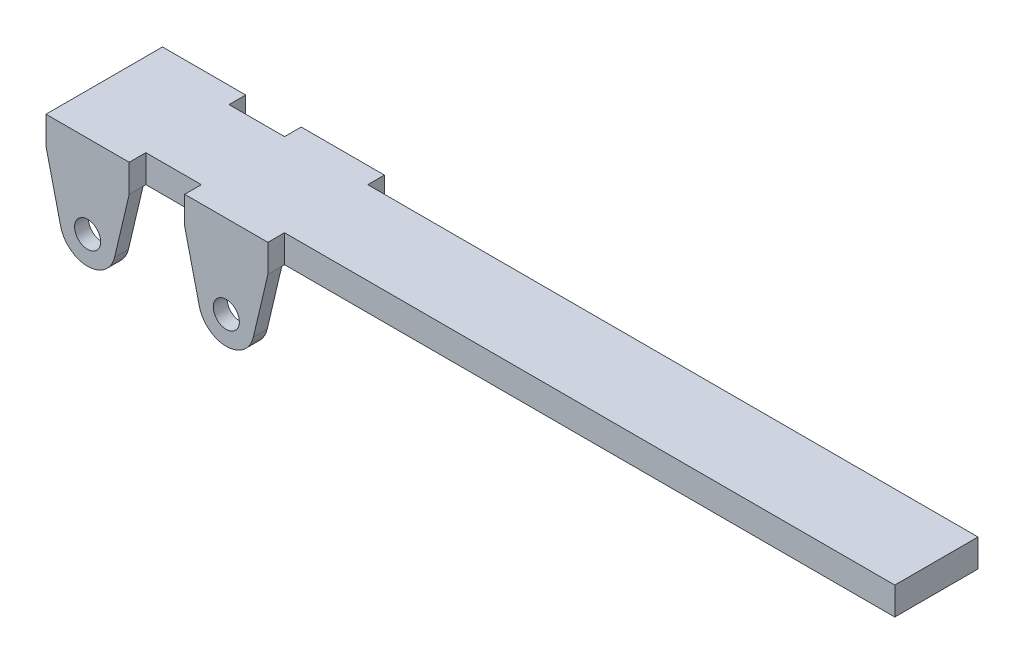
ISO-10303-21;
HEADER;
FILE_DESCRIPTION(('STEP AP214'),'2;1');
FILE_NAME('part.step','',(''),(''),'','','');
FILE_SCHEMA(('AUTOMOTIVE_DESIGN { 1 0 10303 214 1 1 1 1 }'));
ENDSEC;
DATA;
#1=APPLICATION_CONTEXT('core data for automotive mechanical design processes');
#2=APPLICATION_PROTOCOL_DEFINITION('international standard','automotive_design',2000,#1);
#3=PRODUCT_CONTEXT('',#1,'mechanical');
#4=PRODUCT('Part','Part','',(#3));
#5=PRODUCT_RELATED_PRODUCT_CATEGORY('part','',(#4));
#6=PRODUCT_DEFINITION_FORMATION('','',#4);
#7=PRODUCT_DEFINITION_CONTEXT('part definition',#1,'design');
#8=PRODUCT_DEFINITION('design','',#6,#7);
#9=PRODUCT_DEFINITION_SHAPE('','',#8);
#10=(LENGTH_UNIT() NAMED_UNIT(*) SI_UNIT(.MILLI.,.METRE.));
#11=(NAMED_UNIT(*) PLANE_ANGLE_UNIT() SI_UNIT($,.RADIAN.));
#12=(NAMED_UNIT(*) SI_UNIT($,.STERADIAN.) SOLID_ANGLE_UNIT());
#13=UNCERTAINTY_MEASURE_WITH_UNIT(LENGTH_MEASURE(1.E-05),#10,'distance_accuracy_value','');
#14=(GEOMETRIC_REPRESENTATION_CONTEXT(3) GLOBAL_UNCERTAINTY_ASSIGNED_CONTEXT((#13)) GLOBAL_UNIT_ASSIGNED_CONTEXT((#10,
#11,#12)) REPRESENTATION_CONTEXT('',''));
#15=CARTESIAN_POINT('',(0.,0.,0.));
#16=DIRECTION('',(0.,0.,1.));
#17=DIRECTION('',(1.,0.,0.));
#18=AXIS2_PLACEMENT_3D('',#15,#16,#17);
#19=CARTESIAN_POINT('',(0.,0.,0.));
#20=DIRECTION('',(0.,0.,-1.));
#21=DIRECTION('',(-1.,0.,0.));
#22=AXIS2_PLACEMENT_3D('',#19,#20,#21);
#23=PLANE('',#22);
#24=DIRECTION('',(1.,0.,0.));
#25=VECTOR('',#24,1.);
#26=CARTESIAN_POINT('',(150.,0.,0.));
#27=LINE('',#26,#25);
#28=CARTESIAN_POINT('',(40.,0.,0.));
#29=VERTEX_POINT('',#28);
#30=CARTESIAN_POINT('',(150.,0.,0.));
#31=VERTEX_POINT('',#30);
#32=EDGE_CURVE('E265',#29,#31,#27,.T.);
#33=ORIENTED_EDGE('',*,*,#32,.F.);
#34=DIRECTION('',(0.,-1.,0.));
#35=VECTOR('',#34,1.);
#36=CARTESIAN_POINT('',(40.,0.,0.));
#37=LINE('',#36,#35);
#38=CARTESIAN_POINT('',(40.,5.,0.));
#39=VERTEX_POINT('',#38);
#40=EDGE_CURVE('E256',#39,#29,#37,.T.);
#41=ORIENTED_EDGE('',*,*,#40,.F.);
#42=DIRECTION('',(-1.,0.,0.));
#43=VECTOR('',#42,1.);
#44=CARTESIAN_POINT('',(0.,5.,0.));
#45=LINE('',#44,#43);
#46=CARTESIAN_POINT('',(150.,5.,0.));
#47=VERTEX_POINT('',#46);
#48=EDGE_CURVE('E277',#47,#39,#45,.T.);
#49=ORIENTED_EDGE('',*,*,#48,.F.);
#50=DIRECTION('',(0.,1.,0.));
#51=VECTOR('',#50,1.);
#52=CARTESIAN_POINT('',(150.,5.,0.));
#53=LINE('',#52,#51);
#54=EDGE_CURVE('E282',#31,#47,#53,.T.);
#55=ORIENTED_EDGE('',*,*,#54,.F.);
#56=EDGE_LOOP('',(#33,#41,#49,#55));
#57=FACE_BOUND('',#56,.T.);
#58=ADVANCED_FACE('F41',(#57),#23,.T.);
#59=CARTESIAN_POINT('',(25.,5.,0.));
#60=VERTEX_POINT('',#59);
#61=CARTESIAN_POINT('',(15.,5.,0.));
#62=VERTEX_POINT('',#61);
#63=EDGE_CURVE('E284',#60,#62,#45,.T.);
#64=ORIENTED_EDGE('',*,*,#63,.F.);
#65=DIRECTION('',(0.,1.,0.));
#66=VECTOR('',#65,1.);
#67=CARTESIAN_POINT('',(25.,0.,0.));
#68=LINE('',#67,#66);
#69=CARTESIAN_POINT('',(25.,0.,0.));
#70=VERTEX_POINT('',#69);
#71=EDGE_CURVE('E344',#70,#60,#68,.T.);
#72=ORIENTED_EDGE('',*,*,#71,.F.);
#73=CARTESIAN_POINT('',(15.,0.,0.));
#74=VERTEX_POINT('',#73);
#75=EDGE_CURVE('E268',#74,#70,#27,.T.);
#76=ORIENTED_EDGE('',*,*,#75,.F.);
#77=DIRECTION('',(0.,1.,0.));
#78=VECTOR('',#77,1.);
#79=CARTESIAN_POINT('',(15.,0.,0.));
#80=LINE('',#79,#78);
#81=EDGE_CURVE('E421',#74,#62,#80,.T.);
#82=ORIENTED_EDGE('',*,*,#81,.T.);
#83=EDGE_LOOP('',(#64,#72,#76,#82));
#84=FACE_BOUND('',#83,.T.);
#85=ADVANCED_FACE('F509',(#84),#23,.T.);
#86=CARTESIAN_POINT('',(0.,0.,15.));
#87=DIRECTION('',(0.,0.,-1.));
#88=DIRECTION('',(-1.,0.,0.));
#89=AXIS2_PLACEMENT_3D('',#86,#87,#88);
#90=PLANE('',#89);
#91=DIRECTION('',(-1.,0.,0.));
#92=VECTOR('',#91,1.);
#93=CARTESIAN_POINT('',(0.,5.,15.));
#94=LINE('',#93,#92);
#95=CARTESIAN_POINT('',(150.,5.,15.));
#96=VERTEX_POINT('',#95);
#97=CARTESIAN_POINT('',(40.,5.,15.));
#98=VERTEX_POINT('',#97);
#99=EDGE_CURVE('E242',#96,#98,#94,.T.);
#100=ORIENTED_EDGE('',*,*,#99,.T.);
#101=DIRECTION('',(0.,-1.,0.));
#102=VECTOR('',#101,1.);
#103=CARTESIAN_POINT('',(40.,0.,15.));
#104=LINE('',#103,#102);
#105=CARTESIAN_POINT('',(40.,0.,15.));
#106=VERTEX_POINT('',#105);
#107=EDGE_CURVE('E376',#98,#106,#104,.T.);
#108=ORIENTED_EDGE('',*,*,#107,.T.);
#109=DIRECTION('',(1.,0.,0.));
#110=VECTOR('',#109,1.);
#111=CARTESIAN_POINT('',(150.,0.,15.));
#112=LINE('',#111,#110);
#113=CARTESIAN_POINT('',(150.,0.,15.));
#114=VERTEX_POINT('',#113);
#115=EDGE_CURVE('E274',#106,#114,#112,.T.);
#116=ORIENTED_EDGE('',*,*,#115,.T.);
#117=DIRECTION('',(0.,1.,0.));
#118=VECTOR('',#117,1.);
#119=CARTESIAN_POINT('',(150.,5.,15.));
#120=LINE('',#119,#118);
#121=EDGE_CURVE('E278',#114,#96,#120,.T.);
#122=ORIENTED_EDGE('',*,*,#121,.T.);
#123=EDGE_LOOP('',(#100,#108,#116,#122));
#124=FACE_BOUND('',#123,.T.);
#125=ADVANCED_FACE('F554',(#124),#90,.F.);
#126=CARTESIAN_POINT('',(15.,0.,15.));
#127=VERTEX_POINT('',#126);
#128=CARTESIAN_POINT('',(25.,0.,15.));
#129=VERTEX_POINT('',#128);
#130=EDGE_CURVE('E276',#127,#129,#112,.T.);
#131=ORIENTED_EDGE('',*,*,#130,.T.);
#132=DIRECTION('',(0.,1.,0.));
#133=VECTOR('',#132,1.);
#134=CARTESIAN_POINT('',(25.,0.,15.));
#135=LINE('',#134,#133);
#136=CARTESIAN_POINT('',(25.,5.,15.));
#137=VERTEX_POINT('',#136);
#138=EDGE_CURVE('E381',#129,#137,#135,.T.);
#139=ORIENTED_EDGE('',*,*,#138,.T.);
#140=CARTESIAN_POINT('',(15.,5.,15.));
#141=VERTEX_POINT('',#140);
#142=EDGE_CURVE('E280',#137,#141,#94,.T.);
#143=ORIENTED_EDGE('',*,*,#142,.T.);
#144=DIRECTION('',(0.,1.,0.));
#145=VECTOR('',#144,1.);
#146=CARTESIAN_POINT('',(15.,0.,15.));
#147=LINE('',#146,#145);
#148=EDGE_CURVE('E457',#127,#141,#147,.T.);
#149=ORIENTED_EDGE('',*,*,#148,.F.);
#150=EDGE_LOOP('',(#131,#139,#143,#149));
#151=FACE_BOUND('',#150,.T.);
#152=ADVANCED_FACE('F558',(#151),#90,.F.);
#153=CARTESIAN_POINT('',(150.,0.,15.));
#154=DIRECTION('',(0.,1.,0.));
#155=DIRECTION('',(-1.,0.,0.));
#156=AXIS2_PLACEMENT_3D('',#153,#154,#155);
#157=PLANE('',#156);
#158=DIRECTION('',(0.,0.,-1.));
#159=VECTOR('',#158,1.);
#160=CARTESIAN_POINT('',(150.,0.,15.));
#161=LINE('',#160,#159);
#162=EDGE_CURVE('E11',#114,#31,#161,.T.);
#163=ORIENTED_EDGE('',*,*,#162,.F.);
#164=ORIENTED_EDGE('',*,*,#115,.F.);
#165=DIRECTION('',(0.,0.,1.));
#166=VECTOR('',#165,1.);
#167=CARTESIAN_POINT('',(40.,0.,18.));
#168=LINE('',#167,#166);
#169=CARTESIAN_POINT('',(40.,0.,15.5));
#170=VERTEX_POINT('',#169);
#171=EDGE_CURVE('E321',#106,#170,#168,.T.);
#172=ORIENTED_EDGE('',*,*,#171,.T.);
#173=DIRECTION('',(-1.,0.,0.));
#174=VECTOR('',#173,1.);
#175=CARTESIAN_POINT('',(53.,0.,15.5));
#176=LINE('',#175,#174);
#177=CARTESIAN_POINT('',(25.,0.,15.5));
#178=VERTEX_POINT('',#177);
#179=EDGE_CURVE('E58',#170,#178,#176,.T.);
#180=ORIENTED_EDGE('',*,*,#179,.T.);
#181=DIRECTION('',(0.,0.,-1.));
#182=VECTOR('',#181,1.);
#183=CARTESIAN_POINT('',(25.,0.,18.));
#184=LINE('',#183,#182);
#185=EDGE_CURVE('E324',#178,#129,#184,.T.);
#186=ORIENTED_EDGE('',*,*,#185,.T.);
#187=ORIENTED_EDGE('',*,*,#130,.F.);
#188=DIRECTION('',(0.,0.,-1.));
#189=VECTOR('',#188,1.);
#190=CARTESIAN_POINT('',(15.,0.,18.));
#191=LINE('',#190,#189);
#192=CARTESIAN_POINT('',(15.,0.,15.5));
#193=VERTEX_POINT('',#192);
#194=EDGE_CURVE('E260',#193,#127,#191,.T.);
#195=ORIENTED_EDGE('',*,*,#194,.F.);
#196=CARTESIAN_POINT('',(0.,0.,15.5));
#197=VERTEX_POINT('',#196);
#198=EDGE_CURVE('E249',#193,#197,#176,.T.);
#199=ORIENTED_EDGE('',*,*,#198,.T.);
#200=DIRECTION('',(0.,0.,-1.));
#201=VECTOR('',#200,1.);
#202=CARTESIAN_POINT('',(0.,0.,15.));
#203=LINE('',#202,#201);
#204=CARTESIAN_POINT('',(0.,0.,-0.5));
#205=VERTEX_POINT('',#204);
#206=EDGE_CURVE('E229',#197,#205,#203,.T.);
#207=ORIENTED_EDGE('',*,*,#206,.T.);
#208=DIRECTION('',(-1.,0.,0.));
#209=VECTOR('',#208,1.);
#210=CARTESIAN_POINT('',(53.,0.,-0.5));
#211=LINE('',#210,#209);
#212=CARTESIAN_POINT('',(15.,0.,-0.5));
#213=VERTEX_POINT('',#212);
#214=EDGE_CURVE('E299',#213,#205,#211,.T.);
#215=ORIENTED_EDGE('',*,*,#214,.F.);
#216=DIRECTION('',(0.,0.,1.));
#217=VECTOR('',#216,1.);
#218=CARTESIAN_POINT('',(15.,0.,-3.));
#219=LINE('',#218,#217);
#220=EDGE_CURVE('E326',#213,#74,#219,.T.);
#221=ORIENTED_EDGE('',*,*,#220,.T.);
#222=ORIENTED_EDGE('',*,*,#75,.T.);
#223=DIRECTION('',(0.,0.,1.));
#224=VECTOR('',#223,1.);
#225=CARTESIAN_POINT('',(25.,0.,-3.));
#226=LINE('',#225,#224);
#227=CARTESIAN_POINT('',(25.,0.,-0.5));
#228=VERTEX_POINT('',#227);
#229=EDGE_CURVE('E363',#228,#70,#226,.T.);
#230=ORIENTED_EDGE('',*,*,#229,.F.);
#231=CARTESIAN_POINT('',(40.,0.,-0.5));
#232=VERTEX_POINT('',#231);
#233=EDGE_CURVE('E292',#232,#228,#211,.T.);
#234=ORIENTED_EDGE('',*,*,#233,.F.);
#235=DIRECTION('',(0.,0.,-1.));
#236=VECTOR('',#235,1.);
#237=CARTESIAN_POINT('',(40.,0.,-3.));
#238=LINE('',#237,#236);
#239=EDGE_CURVE('E318',#29,#232,#238,.T.);
#240=ORIENTED_EDGE('',*,*,#239,.F.);
#241=ORIENTED_EDGE('',*,*,#32,.T.);
#242=EDGE_LOOP('',(#163,#164,#172,#180,#186,#187,#195,#199,#207,#215,#221,#222,#230,#234,#240,#241));
#243=FACE_BOUND('',#242,.T.);
#244=ADVANCED_FACE('F43',(#243),#157,.F.);
#245=CARTESIAN_POINT('',(150.,5.,15.));
#246=DIRECTION('',(-1.,0.,0.));
#247=DIRECTION('',(0.,-1.,0.));
#248=AXIS2_PLACEMENT_3D('',#245,#246,#247);
#249=PLANE('',#248);
#250=ORIENTED_EDGE('',*,*,#54,.T.);
#251=DIRECTION('',(0.,0.,-1.));
#252=VECTOR('',#251,1.);
#253=CARTESIAN_POINT('',(150.,5.,15.));
#254=LINE('',#253,#252);
#255=EDGE_CURVE('E50',#96,#47,#254,.T.);
#256=ORIENTED_EDGE('',*,*,#255,.F.);
#257=ORIENTED_EDGE('',*,*,#121,.F.);
#258=ORIENTED_EDGE('',*,*,#162,.T.);
#259=EDGE_LOOP('',(#250,#256,#257,#258));
#260=FACE_BOUND('',#259,.T.);
#261=ADVANCED_FACE('F562',(#260),#249,.F.);
#262=CARTESIAN_POINT('',(0.,5.,15.));
#263=DIRECTION('',(0.,-1.,0.));
#264=DIRECTION('',(0.,0.,-1.));
#265=AXIS2_PLACEMENT_3D('',#262,#263,#264);
#266=PLANE('',#265);
#267=ORIENTED_EDGE('',*,*,#48,.T.);
#268=DIRECTION('',(0.,0.,1.));
#269=VECTOR('',#268,1.);
#270=CARTESIAN_POINT('',(40.,5.,-3.));
#271=LINE('',#270,#269);
#272=CARTESIAN_POINT('',(40.,5.,-3.));
#273=VERTEX_POINT('',#272);
#274=EDGE_CURVE('E357',#273,#39,#271,.T.);
#275=ORIENTED_EDGE('',*,*,#274,.F.);
#276=DIRECTION('',(1.,0.,0.));
#277=VECTOR('',#276,1.);
#278=CARTESIAN_POINT('',(40.,5.,-3.));
#279=LINE('',#278,#277);
#280=CARTESIAN_POINT('',(25.,5.,-3.));
#281=VERTEX_POINT('',#280);
#282=EDGE_CURVE('E352',#281,#273,#279,.T.);
#283=ORIENTED_EDGE('',*,*,#282,.F.);
#284=DIRECTION('',(0.,0.,1.));
#285=VECTOR('',#284,1.);
#286=CARTESIAN_POINT('',(25.,5.,-3.));
#287=LINE('',#286,#285);
#288=EDGE_CURVE('E66',#281,#60,#287,.T.);
#289=ORIENTED_EDGE('',*,*,#288,.T.);
#290=ORIENTED_EDGE('',*,*,#63,.T.);
#291=DIRECTION('',(0.,0.,1.));
#292=VECTOR('',#291,1.);
#293=CARTESIAN_POINT('',(15.,5.,-3.));
#294=LINE('',#293,#292);
#295=CARTESIAN_POINT('',(15.,5.,-3.));
#296=VERTEX_POINT('',#295);
#297=EDGE_CURVE('E454',#296,#62,#294,.T.);
#298=ORIENTED_EDGE('',*,*,#297,.F.);
#299=DIRECTION('',(-1.,0.,0.));
#300=VECTOR('',#299,1.);
#301=CARTESIAN_POINT('',(0.,5.,-3.));
#302=LINE('',#301,#300);
#303=CARTESIAN_POINT('',(0.,5.,-3.));
#304=VERTEX_POINT('',#303);
#305=EDGE_CURVE('E424',#296,#304,#302,.T.);
#306=ORIENTED_EDGE('',*,*,#305,.T.);
#307=DIRECTION('',(0.,0.,-1.));
#308=VECTOR('',#307,1.);
#309=CARTESIAN_POINT('',(0.,5.,15.));
#310=LINE('',#309,#308);
#311=CARTESIAN_POINT('',(0.,5.,18.));
#312=VERTEX_POINT('',#311);
#313=EDGE_CURVE('E241',#312,#304,#310,.T.);
#314=ORIENTED_EDGE('',*,*,#313,.F.);
#315=DIRECTION('',(-1.,0.,0.));
#316=VECTOR('',#315,1.);
#317=CARTESIAN_POINT('',(0.,5.,18.));
#318=LINE('',#317,#316);
#319=CARTESIAN_POINT('',(15.,5.,18.));
#320=VERTEX_POINT('',#319);
#321=EDGE_CURVE('E467',#320,#312,#318,.T.);
#322=ORIENTED_EDGE('',*,*,#321,.F.);
#323=DIRECTION('',(0.,0.,-1.));
#324=VECTOR('',#323,1.);
#325=CARTESIAN_POINT('',(15.,5.,18.));
#326=LINE('',#325,#324);
#327=EDGE_CURVE('E473',#320,#141,#326,.T.);
#328=ORIENTED_EDGE('',*,*,#327,.T.);
#329=ORIENTED_EDGE('',*,*,#142,.F.);
#330=DIRECTION('',(0.,0.,-1.));
#331=VECTOR('',#330,1.);
#332=CARTESIAN_POINT('',(25.,5.,18.));
#333=LINE('',#332,#331);
#334=CARTESIAN_POINT('',(25.,5.,18.));
#335=VERTEX_POINT('',#334);
#336=EDGE_CURVE('E415',#335,#137,#333,.T.);
#337=ORIENTED_EDGE('',*,*,#336,.F.);
#338=DIRECTION('',(1.,0.,0.));
#339=VECTOR('',#338,1.);
#340=CARTESIAN_POINT('',(40.,5.,18.));
#341=LINE('',#340,#339);
#342=CARTESIAN_POINT('',(40.,5.,18.));
#343=VERTEX_POINT('',#342);
#344=EDGE_CURVE('E380',#335,#343,#341,.T.);
#345=ORIENTED_EDGE('',*,*,#344,.T.);
#346=DIRECTION('',(0.,0.,-1.));
#347=VECTOR('',#346,1.);
#348=CARTESIAN_POINT('',(40.,5.,18.));
#349=LINE('',#348,#347);
#350=EDGE_CURVE('E418',#343,#98,#349,.T.);
#351=ORIENTED_EDGE('',*,*,#350,.T.);
#352=ORIENTED_EDGE('',*,*,#99,.F.);
#353=ORIENTED_EDGE('',*,*,#255,.T.);
#354=EDGE_LOOP('',(#267,#275,#283,#289,#290,#298,#306,#314,#322,#328,#329,#337,#345,#351,#352,#353));
#355=FACE_BOUND('',#354,.T.);
#356=ADVANCED_FACE('F501',(#355),#266,.F.);
#357=CARTESIAN_POINT('',(0.,0.,15.));
#358=DIRECTION('',(1.,0.,0.));
#359=DIRECTION('',(0.,0.,-1.));
#360=AXIS2_PLACEMENT_3D('',#357,#358,#359);
#361=PLANE('',#360);
#362=ORIENTED_EDGE('',*,*,#313,.T.);
#363=DIRECTION('',(0.,-1.,0.));
#364=VECTOR('',#363,1.);
#365=CARTESIAN_POINT('',(0.,0.,-3.));
#366=LINE('',#365,#364);
#367=CARTESIAN_POINT('',(0.,0.,-3.));
#368=VERTEX_POINT('',#367);
#369=EDGE_CURVE('E422',#304,#368,#366,.T.);
#370=ORIENTED_EDGE('',*,*,#369,.T.);
#371=DIRECTION('',(0.,0.,1.));
#372=VECTOR('',#371,1.);
#373=CARTESIAN_POINT('',(0.,0.,-3.));
#374=LINE('',#373,#372);
#375=EDGE_CURVE('E236',#368,#205,#374,.T.);
#376=ORIENTED_EDGE('',*,*,#375,.T.);
#377=ORIENTED_EDGE('',*,*,#206,.F.);
#378=DIRECTION('',(0.,0.,-1.));
#379=VECTOR('',#378,1.);
#380=CARTESIAN_POINT('',(0.,0.,18.));
#381=LINE('',#380,#379);
#382=CARTESIAN_POINT('',(0.,0.,18.));
#383=VERTEX_POINT('',#382);
#384=EDGE_CURVE('E234',#383,#197,#381,.T.);
#385=ORIENTED_EDGE('',*,*,#384,.F.);
#386=DIRECTION('',(0.,-1.,0.));
#387=VECTOR('',#386,1.);
#388=CARTESIAN_POINT('',(0.,0.,18.));
#389=LINE('',#388,#387);
#390=EDGE_CURVE('E458',#312,#383,#389,.T.);
#391=ORIENTED_EDGE('',*,*,#390,.F.);
#392=EDGE_LOOP('',(#362,#370,#376,#377,#385,#391));
#393=FACE_BOUND('',#392,.T.);
#394=ADVANCED_FACE('F231',(#393),#361,.F.);
#395=CARTESIAN_POINT('',(0.,0.,18.));
#396=DIRECTION('',(0.973212111192934,0.229909083394701,0.));
#397=DIRECTION('',(-0.229909083394701,0.973212111192934,0.));
#398=AXIS2_PLACEMENT_3D('',#395,#396,#397);
#399=PLANE('',#398);
#400=ORIENTED_EDGE('',*,*,#384,.T.);
#401=DIRECTION('',(0.229909083394701,-0.973212111192934,0.));
#402=VECTOR('',#401,1.);
#403=CARTESIAN_POINT('',(0.,0.,15.5));
#404=LINE('',#403,#402);
#405=CARTESIAN_POINT('',(2.63393944403533,-11.1495454169735,15.5));
#406=VERTEX_POINT('',#405);
#407=EDGE_CURVE('E247',#197,#406,#404,.T.);
#408=ORIENTED_EDGE('',*,*,#407,.T.);
#409=DIRECTION('',(0.,0.,-1.));
#410=VECTOR('',#409,1.);
#411=CARTESIAN_POINT('',(2.63393944403533,-11.1495454169735,18.));
#412=LINE('',#411,#410);
#413=CARTESIAN_POINT('',(2.63393944403533,-11.1495454169735,18.));
#414=VERTEX_POINT('',#413);
#415=EDGE_CURVE('E266',#414,#406,#412,.T.);
#416=ORIENTED_EDGE('',*,*,#415,.F.);
#417=DIRECTION('',(0.229909083394701,-0.973212111192934,0.));
#418=VECTOR('',#417,1.);
#419=CARTESIAN_POINT('',(0.,0.,18.));
#420=LINE('',#419,#418);
#421=EDGE_CURVE('E263',#383,#414,#420,.T.);
#422=ORIENTED_EDGE('',*,*,#421,.F.);
#423=EDGE_LOOP('',(#400,#408,#416,#422));
#424=FACE_BOUND('',#423,.T.);
#425=ADVANCED_FACE('F262',(#424),#399,.F.);
#426=CARTESIAN_POINT('',(7.5,-10.,18.));
#427=DIRECTION('',(0.,0.,-1.));
#428=DIRECTION('',(-1.,0.,0.));
#429=AXIS2_PLACEMENT_3D('',#426,#427,#428);
#430=CYLINDRICAL_SURFACE('',#429,5.);
#431=ORIENTED_EDGE('',*,*,#415,.T.);
#432=CARTESIAN_POINT('',(7.5,-10.,15.5));
#433=DIRECTION('',(0.,0.,1.));
#434=DIRECTION('',(0.,-1.,0.));
#435=AXIS2_PLACEMENT_3D('',#432,#433,#434);
#436=CIRCLE('',#435,5.);
#437=CARTESIAN_POINT('',(12.3660605559647,-11.1495454169735,15.5));
#438=VERTEX_POINT('',#437);
#439=EDGE_CURVE('E252',#406,#438,#436,.T.);
#440=ORIENTED_EDGE('',*,*,#439,.T.);
#441=DIRECTION('',(0.,0.,-1.));
#442=VECTOR('',#441,1.);
#443=CARTESIAN_POINT('',(12.3660605559647,-11.1495454169735,18.));
#444=LINE('',#443,#442);
#445=CARTESIAN_POINT('',(12.3660605559647,-11.1495454169735,18.));
#446=VERTEX_POINT('',#445);
#447=EDGE_CURVE('E270',#446,#438,#444,.T.);
#448=ORIENTED_EDGE('',*,*,#447,.F.);
#449=CARTESIAN_POINT('',(7.5,-10.,18.));
#450=DIRECTION('',(0.,0.,1.));
#451=DIRECTION('',(1.,0.,0.));
#452=AXIS2_PLACEMENT_3D('',#449,#450,#451);
#453=CIRCLE('',#452,5.);
#454=EDGE_CURVE('E461',#414,#446,#453,.T.);
#455=ORIENTED_EDGE('',*,*,#454,.F.);
#456=EDGE_LOOP('',(#431,#440,#448,#455));
#457=FACE_BOUND('',#456,.T.);
#458=ADVANCED_FACE('F488',(#457),#430,.T.);
#459=CARTESIAN_POINT('',(14.2071272005891,-3.35625456649483,18.));
#460=DIRECTION('',(-0.973212111192934,0.2299090833947,0.));
#461=DIRECTION('',(-0.2299090833947,-0.973212111192935,0.));
#462=AXIS2_PLACEMENT_3D('',#459,#460,#461);
#463=PLANE('',#462);
#464=ORIENTED_EDGE('',*,*,#447,.T.);
#465=DIRECTION('',(0.2299090833947,0.973212111192935,0.));
#466=VECTOR('',#465,1.);
#467=CARTESIAN_POINT('',(14.2071272005891,-3.35625456649483,15.5));
#468=LINE('',#467,#466);
#469=EDGE_CURVE('E337',#438,#193,#468,.T.);
#470=ORIENTED_EDGE('',*,*,#469,.T.);
#471=DIRECTION('',(0.,0.,-1.));
#472=VECTOR('',#471,1.);
#473=CARTESIAN_POINT('',(15.,0.,18.));
#474=LINE('',#473,#472);
#475=CARTESIAN_POINT('',(15.,0.,18.));
#476=VERTEX_POINT('',#475);
#477=EDGE_CURVE('E478',#476,#193,#474,.T.);
#478=ORIENTED_EDGE('',*,*,#477,.F.);
#479=DIRECTION('',(0.2299090833947,0.973212111192934,0.));
#480=VECTOR('',#479,1.);
#481=CARTESIAN_POINT('',(14.2071272005891,-3.35625456649483,18.));
#482=LINE('',#481,#480);
#483=EDGE_CURVE('E463',#446,#476,#482,.T.);
#484=ORIENTED_EDGE('',*,*,#483,.F.);
#485=EDGE_LOOP('',(#464,#470,#478,#484));
#486=FACE_BOUND('',#485,.T.);
#487=ADVANCED_FACE('F484',(#486),#463,.F.);
#488=CARTESIAN_POINT('',(15.,0.,18.));
#489=DIRECTION('',(-1.,0.,0.));
#490=DIRECTION('',(0.,0.,1.));
#491=AXIS2_PLACEMENT_3D('',#488,#489,#490);
#492=PLANE('',#491);
#493=ORIENTED_EDGE('',*,*,#148,.T.);
#494=ORIENTED_EDGE('',*,*,#327,.F.);
#495=DIRECTION('',(0.,1.,0.));
#496=VECTOR('',#495,1.);
#497=CARTESIAN_POINT('',(15.,0.,18.));
#498=LINE('',#497,#496);
#499=EDGE_CURVE('E465',#476,#320,#498,.T.);
#500=ORIENTED_EDGE('',*,*,#499,.F.);
#501=ORIENTED_EDGE('',*,*,#477,.T.);
#502=ORIENTED_EDGE('',*,*,#194,.T.);
#503=EDGE_LOOP('',(#493,#494,#500,#501,#502));
#504=FACE_BOUND('',#503,.T.);
#505=ADVANCED_FACE('F626',(#504),#492,.F.);
#506=CARTESIAN_POINT('',(7.5,-10.,18.));
#507=DIRECTION('',(0.,0.,-1.));
#508=DIRECTION('',(-1.,0.,0.));
#509=AXIS2_PLACEMENT_3D('',#506,#507,#508);
#510=CYLINDRICAL_SURFACE('',#509,2.35);
#511=CARTESIAN_POINT('',(7.5,-10.,15.5));
#512=DIRECTION('',(0.,0.,1.));
#513=DIRECTION('',(0.,-1.,0.));
#514=AXIS2_PLACEMENT_3D('',#511,#512,#513);
#515=CIRCLE('',#514,2.35);
#516=CARTESIAN_POINT('',(7.5,-12.35,15.5));
#517=VERTEX_POINT('',#516);
#518=EDGE_CURVE('E334',#517,#517,#515,.T.);
#519=ORIENTED_EDGE('',*,*,#518,.F.);
#520=EDGE_LOOP('',(#519));
#521=FACE_BOUND('',#520,.T.);
#522=CARTESIAN_POINT('',(7.5,-10.,18.));
#523=DIRECTION('',(0.,0.,1.));
#524=DIRECTION('',(1.,0.,0.));
#525=AXIS2_PLACEMENT_3D('',#522,#523,#524);
#526=CIRCLE('',#525,2.35);
#527=CARTESIAN_POINT('',(9.85,-10.,18.));
#528=VERTEX_POINT('',#527);
#529=EDGE_CURVE('E470',#528,#528,#526,.T.);
#530=ORIENTED_EDGE('',*,*,#529,.T.);
#531=EDGE_LOOP('',(#530));
#532=FACE_BOUND('',#531,.T.);
#533=ADVANCED_FACE('F629',(#521,#532),#510,.F.);
#534=CARTESIAN_POINT('',(0.,0.,18.));
#535=DIRECTION('',(0.,0.,1.));
#536=DIRECTION('',(1.,0.,0.));
#537=AXIS2_PLACEMENT_3D('',#534,#535,#536);
#538=PLANE('',#537);
#539=ORIENTED_EDGE('',*,*,#390,.T.);
#540=ORIENTED_EDGE('',*,*,#421,.T.);
#541=ORIENTED_EDGE('',*,*,#454,.T.);
#542=ORIENTED_EDGE('',*,*,#483,.T.);
#543=ORIENTED_EDGE('',*,*,#499,.T.);
#544=ORIENTED_EDGE('',*,*,#321,.T.);
#545=EDGE_LOOP('',(#539,#540,#541,#542,#543,#544));
#546=FACE_BOUND('',#545,.T.);
#547=ORIENTED_EDGE('',*,*,#529,.F.);
#548=EDGE_LOOP('',(#547));
#549=FACE_BOUND('',#548,.T.);
#550=ADVANCED_FACE('F490',(#546,#549),#538,.T.);
#551=CARTESIAN_POINT('',(15.,0.,-3.));
#552=DIRECTION('',(1.,0.,0.));
#553=DIRECTION('',(0.,0.,-1.));
#554=AXIS2_PLACEMENT_3D('',#551,#552,#553);
#555=PLANE('',#554);
#556=ORIENTED_EDGE('',*,*,#81,.F.);
#557=ORIENTED_EDGE('',*,*,#220,.F.);
#558=DIRECTION('',(0.,0.,1.));
#559=VECTOR('',#558,1.);
#560=CARTESIAN_POINT('',(15.,0.,-3.));
#561=LINE('',#560,#559);
#562=CARTESIAN_POINT('',(15.,0.,-3.));
#563=VERTEX_POINT('',#562);
#564=EDGE_CURVE('E451',#563,#213,#561,.T.);
#565=ORIENTED_EDGE('',*,*,#564,.F.);
#566=DIRECTION('',(0.,1.,0.));
#567=VECTOR('',#566,1.);
#568=CARTESIAN_POINT('',(15.,0.,-3.));
#569=LINE('',#568,#567);
#570=EDGE_CURVE('E427',#563,#296,#569,.T.);
#571=ORIENTED_EDGE('',*,*,#570,.T.);
#572=ORIENTED_EDGE('',*,*,#297,.T.);
#573=EDGE_LOOP('',(#556,#557,#565,#571,#572));
#574=FACE_BOUND('',#573,.T.);
#575=ADVANCED_FACE('F505',(#574),#555,.T.);
#576=CARTESIAN_POINT('',(14.2071272005891,-3.35625456649483,-3.));
#577=DIRECTION('',(0.973212111192934,-0.2299090833947,0.));
#578=DIRECTION('',(0.2299090833947,0.973212111192935,0.));
#579=AXIS2_PLACEMENT_3D('',#576,#577,#578);
#580=PLANE('',#579);
#581=DIRECTION('',(0.2299090833947,0.973212111192935,0.));
#582=VECTOR('',#581,1.);
#583=CARTESIAN_POINT('',(14.2071272005891,-3.35625456649483,-0.5));
#584=LINE('',#583,#582);
#585=CARTESIAN_POINT('',(12.3660605559647,-11.1495454169735,-0.5));
#586=VERTEX_POINT('',#585);
#587=EDGE_CURVE('E316',#586,#213,#584,.T.);
#588=ORIENTED_EDGE('',*,*,#587,.F.);
#589=DIRECTION('',(0.,0.,1.));
#590=VECTOR('',#589,1.);
#591=CARTESIAN_POINT('',(12.3660605559647,-11.1495454169735,-3.));
#592=LINE('',#591,#590);
#593=CARTESIAN_POINT('',(12.3660605559647,-11.1495454169735,-3.));
#594=VERTEX_POINT('',#593);
#595=EDGE_CURVE('E448',#594,#586,#592,.T.);
#596=ORIENTED_EDGE('',*,*,#595,.F.);
#597=DIRECTION('',(0.2299090833947,0.973212111192934,0.));
#598=VECTOR('',#597,1.);
#599=CARTESIAN_POINT('',(14.2071272005891,-3.35625456649483,-3.));
#600=LINE('',#599,#598);
#601=EDGE_CURVE('E430',#594,#563,#600,.T.);
#602=ORIENTED_EDGE('',*,*,#601,.T.);
#603=ORIENTED_EDGE('',*,*,#564,.T.);
#604=EDGE_LOOP('',(#588,#596,#602,#603));
#605=FACE_BOUND('',#604,.T.);
#606=ADVANCED_FACE('F514',(#605),#580,.T.);
#607=CARTESIAN_POINT('',(7.5,-10.,-3.));
#608=DIRECTION('',(0.,0.,1.));
#609=DIRECTION('',(1.,0.,0.));
#610=AXIS2_PLACEMENT_3D('',#607,#608,#609);
#611=CYLINDRICAL_SURFACE('',#610,5.);
#612=CARTESIAN_POINT('',(7.5,-10.,-0.5));
#613=DIRECTION('',(0.,0.,-1.));
#614=DIRECTION('',(0.,1.,0.));
#615=AXIS2_PLACEMENT_3D('',#612,#613,#614);
#616=CIRCLE('',#615,5.);
#617=CARTESIAN_POINT('',(2.63393944403533,-11.1495454169735,-0.5));
#618=VERTEX_POINT('',#617);
#619=EDGE_CURVE('E314',#618,#586,#616,.F.);
#620=ORIENTED_EDGE('',*,*,#619,.F.);
#621=DIRECTION('',(0.,0.,1.));
#622=VECTOR('',#621,1.);
#623=CARTESIAN_POINT('',(2.63393944403533,-11.1495454169735,-3.));
#624=LINE('',#623,#622);
#625=CARTESIAN_POINT('',(2.63393944403533,-11.1495454169735,-3.));
#626=VERTEX_POINT('',#625);
#627=EDGE_CURVE('E445',#626,#618,#624,.T.);
#628=ORIENTED_EDGE('',*,*,#627,.F.);
#629=CARTESIAN_POINT('',(7.5,-10.,-3.));
#630=DIRECTION('',(0.,0.,1.));
#631=DIRECTION('',(1.,0.,0.));
#632=AXIS2_PLACEMENT_3D('',#629,#630,#631);
#633=CIRCLE('',#632,5.);
#634=EDGE_CURVE('E433',#626,#594,#633,.T.);
#635=ORIENTED_EDGE('',*,*,#634,.T.);
#636=ORIENTED_EDGE('',*,*,#595,.T.);
#637=EDGE_LOOP('',(#620,#628,#635,#636));
#638=FACE_BOUND('',#637,.T.);
#639=ADVANCED_FACE('F518',(#638),#611,.T.);
#640=CARTESIAN_POINT('',(0.,0.,-3.));
#641=DIRECTION('',(-0.973212111192934,-0.229909083394701,0.));
#642=DIRECTION('',(0.229909083394701,-0.973212111192934,0.));
#643=AXIS2_PLACEMENT_3D('',#640,#641,#642);
#644=PLANE('',#643);
#645=DIRECTION('',(0.229909083394701,-0.973212111192934,0.));
#646=VECTOR('',#645,1.);
#647=CARTESIAN_POINT('',(0.,0.,-0.5));
#648=LINE('',#647,#646);
#649=EDGE_CURVE('E312',#205,#618,#648,.T.);
#650=ORIENTED_EDGE('',*,*,#649,.F.);
#651=ORIENTED_EDGE('',*,*,#375,.F.);
#652=DIRECTION('',(0.229909083394701,-0.973212111192934,0.));
#653=VECTOR('',#652,1.);
#654=CARTESIAN_POINT('',(0.,0.,-3.));
#655=LINE('',#654,#653);
#656=EDGE_CURVE('E436',#368,#626,#655,.T.);
#657=ORIENTED_EDGE('',*,*,#656,.T.);
#658=ORIENTED_EDGE('',*,*,#627,.T.);
#659=EDGE_LOOP('',(#650,#651,#657,#658));
#660=FACE_BOUND('',#659,.T.);
#661=ADVANCED_FACE('F521',(#660),#644,.T.);
#662=CARTESIAN_POINT('',(7.5,-10.,-3.));
#663=DIRECTION('',(0.,0.,1.));
#664=DIRECTION('',(1.,0.,0.));
#665=AXIS2_PLACEMENT_3D('',#662,#663,#664);
#666=CYLINDRICAL_SURFACE('',#665,2.35);
#667=CARTESIAN_POINT('',(7.5,-10.,-0.5));
#668=DIRECTION('',(0.,0.,-1.));
#669=DIRECTION('',(0.,1.,0.));
#670=AXIS2_PLACEMENT_3D('',#667,#668,#669);
#671=CIRCLE('',#670,2.35);
#672=CARTESIAN_POINT('',(7.5,-7.65,-0.5));
#673=VERTEX_POINT('',#672);
#674=EDGE_CURVE('E309',#673,#673,#671,.F.);
#675=ORIENTED_EDGE('',*,*,#674,.T.);
#676=EDGE_LOOP('',(#675));
#677=FACE_BOUND('',#676,.T.);
#678=CARTESIAN_POINT('',(7.5,-10.,-3.));
#679=DIRECTION('',(0.,0.,1.));
#680=DIRECTION('',(1.,0.,0.));
#681=AXIS2_PLACEMENT_3D('',#678,#679,#680);
#682=CIRCLE('',#681,2.35);
#683=CARTESIAN_POINT('',(9.85,-10.,-3.));
#684=VERTEX_POINT('',#683);
#685=EDGE_CURVE('E439',#684,#684,#682,.T.);
#686=ORIENTED_EDGE('',*,*,#685,.F.);
#687=EDGE_LOOP('',(#686));
#688=FACE_BOUND('',#687,.T.);
#689=ADVANCED_FACE('F531',(#677,#688),#666,.F.);
#690=CARTESIAN_POINT('',(0.,0.,-3.));
#691=DIRECTION('',(0.,0.,-1.));
#692=DIRECTION('',(1.,0.,0.));
#693=AXIS2_PLACEMENT_3D('',#690,#691,#692);
#694=PLANE('',#693);
#695=ORIENTED_EDGE('',*,*,#369,.F.);
#696=ORIENTED_EDGE('',*,*,#305,.F.);
#697=ORIENTED_EDGE('',*,*,#570,.F.);
#698=ORIENTED_EDGE('',*,*,#601,.F.);
#699=ORIENTED_EDGE('',*,*,#634,.F.);
#700=ORIENTED_EDGE('',*,*,#656,.F.);
#701=EDGE_LOOP('',(#695,#696,#697,#698,#699,#700));
#702=FACE_BOUND('',#701,.T.);
#703=ORIENTED_EDGE('',*,*,#685,.T.);
#704=EDGE_LOOP('',(#703));
#705=FACE_BOUND('',#704,.T.);
#706=ADVANCED_FACE('F497',(#702,#705),#694,.T.);
#707=CARTESIAN_POINT('',(40.,0.,18.));
#708=DIRECTION('',(1.,0.,0.));
#709=DIRECTION('',(0.,0.,-1.));
#710=AXIS2_PLACEMENT_3D('',#707,#708,#709);
#711=PLANE('',#710);
#712=ORIENTED_EDGE('',*,*,#107,.F.);
#713=ORIENTED_EDGE('',*,*,#350,.F.);
#714=DIRECTION('',(0.,-1.,0.));
#715=VECTOR('',#714,1.);
#716=CARTESIAN_POINT('',(40.,0.,18.));
#717=LINE('',#716,#715);
#718=CARTESIAN_POINT('',(40.,0.,18.));
#719=VERTEX_POINT('',#718);
#720=EDGE_CURVE('E377',#343,#719,#717,.T.);
#721=ORIENTED_EDGE('',*,*,#720,.T.);
#722=DIRECTION('',(0.,0.,-1.));
#723=VECTOR('',#722,1.);
#724=CARTESIAN_POINT('',(40.,0.,18.));
#725=LINE('',#724,#723);
#726=EDGE_CURVE('E399',#719,#170,#725,.T.);
#727=ORIENTED_EDGE('',*,*,#726,.T.);
#728=ORIENTED_EDGE('',*,*,#171,.F.);
#729=EDGE_LOOP('',(#712,#713,#721,#727,#728));
#730=FACE_BOUND('',#729,.T.);
#731=ADVANCED_FACE('F537',(#730),#711,.T.);
#732=CARTESIAN_POINT('',(25.,0.,18.));
#733=DIRECTION('',(-1.,0.,0.));
#734=DIRECTION('',(0.,0.,1.));
#735=AXIS2_PLACEMENT_3D('',#732,#733,#734);
#736=PLANE('',#735);
#737=ORIENTED_EDGE('',*,*,#138,.F.);
#738=ORIENTED_EDGE('',*,*,#185,.F.);
#739=DIRECTION('',(0.,0.,-1.));
#740=VECTOR('',#739,1.);
#741=CARTESIAN_POINT('',(25.,0.,18.));
#742=LINE('',#741,#740);
#743=CARTESIAN_POINT('',(25.,0.,18.));
#744=VERTEX_POINT('',#743);
#745=EDGE_CURVE('E412',#744,#178,#742,.T.);
#746=ORIENTED_EDGE('',*,*,#745,.F.);
#747=DIRECTION('',(0.,1.,0.));
#748=VECTOR('',#747,1.);
#749=CARTESIAN_POINT('',(25.,0.,18.));
#750=LINE('',#749,#748);
#751=EDGE_CURVE('E384',#744,#335,#750,.T.);
#752=ORIENTED_EDGE('',*,*,#751,.T.);
#753=ORIENTED_EDGE('',*,*,#336,.T.);
#754=EDGE_LOOP('',(#737,#738,#746,#752,#753));
#755=FACE_BOUND('',#754,.T.);
#756=ADVANCED_FACE('F544',(#755),#736,.T.);
#757=CARTESIAN_POINT('',(25.7928727994109,-3.35625456649483,18.));
#758=DIRECTION('',(-0.973212111192934,-0.2299090833947,0.));
#759=DIRECTION('',(0.2299090833947,-0.973212111192935,0.));
#760=AXIS2_PLACEMENT_3D('',#757,#758,#759);
#761=PLANE('',#760);
#762=DIRECTION('',(-0.2299090833947,0.973212111192935,0.));
#763=VECTOR('',#762,1.);
#764=CARTESIAN_POINT('',(25.7928727994109,-3.35625456649483,15.5));
#765=LINE('',#764,#763);
#766=CARTESIAN_POINT('',(27.6339394440353,-11.1495454169735,15.5));
#767=VERTEX_POINT('',#766);
#768=EDGE_CURVE('E332',#767,#178,#765,.T.);
#769=ORIENTED_EDGE('',*,*,#768,.F.);
#770=DIRECTION('',(0.,0.,-1.));
#771=VECTOR('',#770,1.);
#772=CARTESIAN_POINT('',(27.6339394440353,-11.1495454169735,18.));
#773=LINE('',#772,#771);
#774=CARTESIAN_POINT('',(27.6339394440353,-11.1495454169735,18.));
#775=VERTEX_POINT('',#774);
#776=EDGE_CURVE('E409',#775,#767,#773,.T.);
#777=ORIENTED_EDGE('',*,*,#776,.F.);
#778=DIRECTION('',(-0.2299090833947,0.973212111192934,0.));
#779=VECTOR('',#778,1.);
#780=CARTESIAN_POINT('',(25.7928727994109,-3.35625456649483,18.));
#781=LINE('',#780,#779);
#782=EDGE_CURVE('E387',#775,#744,#781,.T.);
#783=ORIENTED_EDGE('',*,*,#782,.T.);
#784=ORIENTED_EDGE('',*,*,#745,.T.);
#785=EDGE_LOOP('',(#769,#777,#783,#784));
#786=FACE_BOUND('',#785,.T.);
#787=ADVANCED_FACE('F612',(#786),#761,.T.);
#788=CARTESIAN_POINT('',(32.5,-10.,18.));
#789=DIRECTION('',(0.,0.,-1.));
#790=DIRECTION('',(-1.,0.,0.));
#791=AXIS2_PLACEMENT_3D('',#788,#789,#790);
#792=CYLINDRICAL_SURFACE('',#791,5.);
#793=CARTESIAN_POINT('',(32.5,-10.,15.5));
#794=DIRECTION('',(0.,0.,1.));
#795=DIRECTION('',(0.,-1.,0.));
#796=AXIS2_PLACEMENT_3D('',#793,#794,#795);
#797=CIRCLE('',#796,5.);
#798=CARTESIAN_POINT('',(37.3660605559647,-11.1495454169735,15.5));
#799=VERTEX_POINT('',#798);
#800=EDGE_CURVE('E330',#799,#767,#797,.F.);
#801=ORIENTED_EDGE('',*,*,#800,.F.);
#802=DIRECTION('',(0.,0.,-1.));
#803=VECTOR('',#802,1.);
#804=CARTESIAN_POINT('',(37.3660605559647,-11.1495454169735,18.));
#805=LINE('',#804,#803);
#806=CARTESIAN_POINT('',(37.3660605559647,-11.1495454169735,18.));
#807=VERTEX_POINT('',#806);
#808=EDGE_CURVE('E406',#807,#799,#805,.T.);
#809=ORIENTED_EDGE('',*,*,#808,.F.);
#810=CARTESIAN_POINT('',(32.5,-10.,18.));
#811=DIRECTION('',(0.,0.,-1.));
#812=DIRECTION('',(-1.,0.,0.));
#813=AXIS2_PLACEMENT_3D('',#810,#811,#812);
#814=CIRCLE('',#813,5.);
#815=EDGE_CURVE('E390',#807,#775,#814,.T.);
#816=ORIENTED_EDGE('',*,*,#815,.T.);
#817=ORIENTED_EDGE('',*,*,#776,.T.);
#818=EDGE_LOOP('',(#801,#809,#816,#817));
#819=FACE_BOUND('',#818,.T.);
#820=ADVANCED_FACE('F608',(#819),#792,.T.);
#821=CARTESIAN_POINT('',(40.,0.,18.));
#822=DIRECTION('',(0.973212111192934,-0.229909083394701,0.));
#823=DIRECTION('',(0.229909083394701,0.973212111192934,0.));
#824=AXIS2_PLACEMENT_3D('',#821,#822,#823);
#825=PLANE('',#824);
#826=DIRECTION('',(-0.229909083394701,-0.973212111192934,0.));
#827=VECTOR('',#826,1.);
#828=CARTESIAN_POINT('',(40.,0.,15.5));
#829=LINE('',#828,#827);
#830=EDGE_CURVE('E328',#170,#799,#829,.T.);
#831=ORIENTED_EDGE('',*,*,#830,.F.);
#832=ORIENTED_EDGE('',*,*,#726,.F.);
#833=DIRECTION('',(-0.229909083394701,-0.973212111192934,0.));
#834=VECTOR('',#833,1.);
#835=CARTESIAN_POINT('',(40.,0.,18.));
#836=LINE('',#835,#834);
#837=EDGE_CURVE('E393',#719,#807,#836,.T.);
#838=ORIENTED_EDGE('',*,*,#837,.T.);
#839=ORIENTED_EDGE('',*,*,#808,.T.);
#840=EDGE_LOOP('',(#831,#832,#838,#839));
#841=FACE_BOUND('',#840,.T.);
#842=ADVANCED_FACE('F603',(#841),#825,.T.);
#843=CARTESIAN_POINT('',(32.5,-10.,18.));
#844=DIRECTION('',(0.,0.,-1.));
#845=DIRECTION('',(-1.,0.,0.));
#846=AXIS2_PLACEMENT_3D('',#843,#844,#845);
#847=CYLINDRICAL_SURFACE('',#846,2.35);
#848=CARTESIAN_POINT('',(32.5,-10.,15.5));
#849=DIRECTION('',(0.,0.,1.));
#850=DIRECTION('',(0.,-1.,0.));
#851=AXIS2_PLACEMENT_3D('',#848,#849,#850);
#852=CIRCLE('',#851,2.35);
#853=CARTESIAN_POINT('',(32.5,-12.35,15.5));
#854=VERTEX_POINT('',#853);
#855=EDGE_CURVE('E45',#854,#854,#852,.F.);
#856=ORIENTED_EDGE('',*,*,#855,.T.);
#857=EDGE_LOOP('',(#856));
#858=FACE_BOUND('',#857,.T.);
#859=CARTESIAN_POINT('',(32.5,-10.,18.));
#860=DIRECTION('',(0.,0.,-1.));
#861=DIRECTION('',(-1.,0.,0.));
#862=AXIS2_PLACEMENT_3D('',#859,#860,#861);
#863=CIRCLE('',#862,2.35);
#864=CARTESIAN_POINT('',(30.15,-10.,18.));
#865=VERTEX_POINT('',#864);
#866=EDGE_CURVE('E396',#865,#865,#863,.T.);
#867=ORIENTED_EDGE('',*,*,#866,.F.);
#868=EDGE_LOOP('',(#867));
#869=FACE_BOUND('',#868,.T.);
#870=ADVANCED_FACE('F835',(#858,#869),#847,.F.);
#871=CARTESIAN_POINT('',(40.,0.,18.));
#872=DIRECTION('',(0.,0.,1.));
#873=DIRECTION('',(-1.,0.,0.));
#874=AXIS2_PLACEMENT_3D('',#871,#872,#873);
#875=PLANE('',#874);
#876=ORIENTED_EDGE('',*,*,#720,.F.);
#877=ORIENTED_EDGE('',*,*,#344,.F.);
#878=ORIENTED_EDGE('',*,*,#751,.F.);
#879=ORIENTED_EDGE('',*,*,#782,.F.);
#880=ORIENTED_EDGE('',*,*,#815,.F.);
#881=ORIENTED_EDGE('',*,*,#837,.F.);
#882=EDGE_LOOP('',(#876,#877,#878,#879,#880,#881));
#883=FACE_BOUND('',#882,.T.);
#884=ORIENTED_EDGE('',*,*,#866,.T.);
#885=EDGE_LOOP('',(#884));
#886=FACE_BOUND('',#885,.T.);
#887=ADVANCED_FACE('F615',(#883,#886),#875,.T.);
#888=CARTESIAN_POINT('',(40.,0.,-3.));
#889=DIRECTION('',(-1.,0.,0.));
#890=DIRECTION('',(0.,0.,1.));
#891=AXIS2_PLACEMENT_3D('',#888,#889,#890);
#892=PLANE('',#891);
#893=ORIENTED_EDGE('',*,*,#40,.T.);
#894=ORIENTED_EDGE('',*,*,#239,.T.);
#895=DIRECTION('',(0.,0.,1.));
#896=VECTOR('',#895,1.);
#897=CARTESIAN_POINT('',(40.,0.,-3.));
#898=LINE('',#897,#896);
#899=CARTESIAN_POINT('',(40.,0.,-3.));
#900=VERTEX_POINT('',#899);
#901=EDGE_CURVE('E373',#900,#232,#898,.T.);
#902=ORIENTED_EDGE('',*,*,#901,.F.);
#903=DIRECTION('',(0.,-1.,0.));
#904=VECTOR('',#903,1.);
#905=CARTESIAN_POINT('',(40.,0.,-3.));
#906=LINE('',#905,#904);
#907=EDGE_CURVE('E340',#273,#900,#906,.T.);
#908=ORIENTED_EDGE('',*,*,#907,.F.);
#909=ORIENTED_EDGE('',*,*,#274,.T.);
#910=EDGE_LOOP('',(#893,#894,#902,#908,#909));
#911=FACE_BOUND('',#910,.T.);
#912=ADVANCED_FACE('F576',(#911),#892,.F.);
#913=CARTESIAN_POINT('',(40.,0.,-3.));
#914=DIRECTION('',(-0.973212111192934,0.229909083394701,0.));
#915=DIRECTION('',(-0.229909083394701,-0.973212111192934,0.));
#916=AXIS2_PLACEMENT_3D('',#913,#914,#915);
#917=PLANE('',#916);
#918=ORIENTED_EDGE('',*,*,#901,.T.);
#919=DIRECTION('',(-0.229909083394701,-0.973212111192934,0.));
#920=VECTOR('',#919,1.);
#921=CARTESIAN_POINT('',(40.,0.,-0.5));
#922=LINE('',#921,#920);
#923=CARTESIAN_POINT('',(37.3660605559647,-11.1495454169735,-0.5));
#924=VERTEX_POINT('',#923);
#925=EDGE_CURVE('E306',#232,#924,#922,.T.);
#926=ORIENTED_EDGE('',*,*,#925,.T.);
#927=DIRECTION('',(0.,0.,1.));
#928=VECTOR('',#927,1.);
#929=CARTESIAN_POINT('',(37.3660605559647,-11.1495454169735,-3.));
#930=LINE('',#929,#928);
#931=CARTESIAN_POINT('',(37.3660605559647,-11.1495454169735,-3.));
#932=VERTEX_POINT('',#931);
#933=EDGE_CURVE('E370',#932,#924,#930,.T.);
#934=ORIENTED_EDGE('',*,*,#933,.F.);
#935=DIRECTION('',(-0.229909083394701,-0.973212111192934,0.));
#936=VECTOR('',#935,1.);
#937=CARTESIAN_POINT('',(40.,0.,-3.));
#938=LINE('',#937,#936);
#939=EDGE_CURVE('E343',#900,#932,#938,.T.);
#940=ORIENTED_EDGE('',*,*,#939,.F.);
#941=EDGE_LOOP('',(#918,#926,#934,#940));
#942=FACE_BOUND('',#941,.T.);
#943=ADVANCED_FACE('F595',(#942),#917,.F.);
#944=CARTESIAN_POINT('',(32.5,-10.,-3.));
#945=DIRECTION('',(0.,0.,1.));
#946=DIRECTION('',(1.,0.,0.));
#947=AXIS2_PLACEMENT_3D('',#944,#945,#946);
#948=CYLINDRICAL_SURFACE('',#947,5.);
#949=ORIENTED_EDGE('',*,*,#933,.T.);
#950=CARTESIAN_POINT('',(32.5,-10.,-0.5));
#951=DIRECTION('',(0.,0.,-1.));
#952=DIRECTION('',(0.,1.,0.));
#953=AXIS2_PLACEMENT_3D('',#950,#951,#952);
#954=CIRCLE('',#953,5.);
#955=CARTESIAN_POINT('',(27.6339394440353,-11.1495454169735,-0.5));
#956=VERTEX_POINT('',#955);
#957=EDGE_CURVE('E296',#924,#956,#954,.T.);
#958=ORIENTED_EDGE('',*,*,#957,.T.);
#959=DIRECTION('',(0.,0.,1.));
#960=VECTOR('',#959,1.);
#961=CARTESIAN_POINT('',(27.6339394440353,-11.1495454169735,-3.));
#962=LINE('',#961,#960);
#963=CARTESIAN_POINT('',(27.6339394440353,-11.1495454169735,-3.));
#964=VERTEX_POINT('',#963);
#965=EDGE_CURVE('E367',#964,#956,#962,.T.);
#966=ORIENTED_EDGE('',*,*,#965,.F.);
#967=CARTESIAN_POINT('',(32.5,-10.,-3.));
#968=DIRECTION('',(0.,0.,-1.));
#969=DIRECTION('',(-1.,0.,0.));
#970=AXIS2_PLACEMENT_3D('',#967,#968,#969);
#971=CIRCLE('',#970,5.);
#972=EDGE_CURVE('E346',#932,#964,#971,.T.);
#973=ORIENTED_EDGE('',*,*,#972,.F.);
#974=EDGE_LOOP('',(#949,#958,#966,#973));
#975=FACE_BOUND('',#974,.T.);
#976=ADVANCED_FACE('F591',(#975),#948,.T.);
#977=CARTESIAN_POINT('',(25.7928727994109,-3.35625456649483,-3.));
#978=DIRECTION('',(0.973212111192934,0.2299090833947,0.));
#979=DIRECTION('',(-0.2299090833947,0.973212111192935,0.));
#980=AXIS2_PLACEMENT_3D('',#977,#978,#979);
#981=PLANE('',#980);
#982=ORIENTED_EDGE('',*,*,#965,.T.);
#983=DIRECTION('',(-0.2299090833947,0.973212111192935,0.));
#984=VECTOR('',#983,1.);
#985=CARTESIAN_POINT('',(25.7928727994109,-3.35625456649483,-0.5));
#986=LINE('',#985,#984);
#987=EDGE_CURVE('E291',#956,#228,#986,.T.);
#988=ORIENTED_EDGE('',*,*,#987,.T.);
#989=CARTESIAN_POINT('',(25.,0.,-3.));
#990=VERTEX_POINT('',#989);
#991=EDGE_CURVE('E364',#990,#228,#226,.T.);
#992=ORIENTED_EDGE('',*,*,#991,.F.);
#993=DIRECTION('',(-0.2299090833947,0.973212111192934,0.));
#994=VECTOR('',#993,1.);
#995=CARTESIAN_POINT('',(25.7928727994109,-3.35625456649483,-3.));
#996=LINE('',#995,#994);
#997=EDGE_CURVE('E348',#964,#990,#996,.T.);
#998=ORIENTED_EDGE('',*,*,#997,.F.);
#999=EDGE_LOOP('',(#982,#988,#992,#998));
#1000=FACE_BOUND('',#999,.T.);
#1001=ADVANCED_FACE('F588',(#1000),#981,.F.);
#1002=CARTESIAN_POINT('',(25.,0.,-3.));
#1003=DIRECTION('',(1.,0.,0.));
#1004=DIRECTION('',(0.,0.,-1.));
#1005=AXIS2_PLACEMENT_3D('',#1002,#1003,#1004);
#1006=PLANE('',#1005);
#1007=ORIENTED_EDGE('',*,*,#71,.T.);
#1008=ORIENTED_EDGE('',*,*,#288,.F.);
#1009=DIRECTION('',(0.,1.,0.));
#1010=VECTOR('',#1009,1.);
#1011=CARTESIAN_POINT('',(25.,0.,-3.));
#1012=LINE('',#1011,#1010);
#1013=EDGE_CURVE('E350',#990,#281,#1012,.T.);
#1014=ORIENTED_EDGE('',*,*,#1013,.F.);
#1015=ORIENTED_EDGE('',*,*,#991,.T.);
#1016=ORIENTED_EDGE('',*,*,#229,.T.);
#1017=EDGE_LOOP('',(#1007,#1008,#1014,#1015,#1016));
#1018=FACE_BOUND('',#1017,.T.);
#1019=ADVANCED_FACE('F586',(#1018),#1006,.F.);
#1020=CARTESIAN_POINT('',(32.5,-10.,-3.));
#1021=DIRECTION('',(0.,0.,1.));
#1022=DIRECTION('',(1.,0.,0.));
#1023=AXIS2_PLACEMENT_3D('',#1020,#1021,#1022);
#1024=CYLINDRICAL_SURFACE('',#1023,2.35);
#1025=CARTESIAN_POINT('',(32.5,-10.,-0.5));
#1026=DIRECTION('',(0.,0.,-1.));
#1027=DIRECTION('',(0.,1.,0.));
#1028=AXIS2_PLACEMENT_3D('',#1025,#1026,#1027);
#1029=CIRCLE('',#1028,2.35);
#1030=CARTESIAN_POINT('',(32.5,-7.65,-0.5));
#1031=VERTEX_POINT('',#1030);
#1032=EDGE_CURVE('E289',#1031,#1031,#1029,.T.);
#1033=ORIENTED_EDGE('',*,*,#1032,.F.);
#1034=EDGE_LOOP('',(#1033));
#1035=FACE_BOUND('',#1034,.T.);
#1036=CARTESIAN_POINT('',(32.5,-10.,-3.));
#1037=DIRECTION('',(0.,0.,-1.));
#1038=DIRECTION('',(-1.,0.,0.));
#1039=AXIS2_PLACEMENT_3D('',#1036,#1037,#1038);
#1040=CIRCLE('',#1039,2.35);
#1041=CARTESIAN_POINT('',(30.15,-10.,-3.));
#1042=VERTEX_POINT('',#1041);
#1043=EDGE_CURVE('E354',#1042,#1042,#1040,.T.);
#1044=ORIENTED_EDGE('',*,*,#1043,.T.);
#1045=EDGE_LOOP('',(#1044));
#1046=FACE_BOUND('',#1045,.T.);
#1047=ADVANCED_FACE('F820',(#1035,#1046),#1024,.F.);
#1048=CARTESIAN_POINT('',(40.,0.,-3.));
#1049=DIRECTION('',(0.,0.,-1.));
#1050=DIRECTION('',(-1.,0.,0.));
#1051=AXIS2_PLACEMENT_3D('',#1048,#1049,#1050);
#1052=PLANE('',#1051);
#1053=ORIENTED_EDGE('',*,*,#907,.T.);
#1054=ORIENTED_EDGE('',*,*,#939,.T.);
#1055=ORIENTED_EDGE('',*,*,#972,.T.);
#1056=ORIENTED_EDGE('',*,*,#997,.T.);
#1057=ORIENTED_EDGE('',*,*,#1013,.T.);
#1058=ORIENTED_EDGE('',*,*,#282,.T.);
#1059=EDGE_LOOP('',(#1053,#1054,#1055,#1056,#1057,#1058));
#1060=FACE_BOUND('',#1059,.T.);
#1061=ORIENTED_EDGE('',*,*,#1043,.F.);
#1062=EDGE_LOOP('',(#1061));
#1063=FACE_BOUND('',#1062,.T.);
#1064=ADVANCED_FACE('F580',(#1060,#1063),#1052,.T.);
#1065=CARTESIAN_POINT('',(53.,-20.,-0.5));
#1066=DIRECTION('',(0.,0.,-1.));
#1067=DIRECTION('',(0.,1.,0.));
#1068=AXIS2_PLACEMENT_3D('',#1065,#1066,#1067);
#1069=PLANE('',#1068);
#1070=ORIENTED_EDGE('',*,*,#1032,.T.);
#1071=EDGE_LOOP('',(#1070));
#1072=FACE_BOUND('',#1071,.T.);
#1073=ORIENTED_EDGE('',*,*,#233,.T.);
#1074=ORIENTED_EDGE('',*,*,#987,.F.);
#1075=ORIENTED_EDGE('',*,*,#957,.F.);
#1076=ORIENTED_EDGE('',*,*,#925,.F.);
#1077=EDGE_LOOP('',(#1073,#1074,#1075,#1076));
#1078=FACE_BOUND('',#1077,.T.);
#1079=ADVANCED_FACE('F528',(#1072,#1078),#1069,.F.);
#1080=CARTESIAN_POINT('',(53.,0.,15.5));
#1081=DIRECTION('',(0.,0.,1.));
#1082=DIRECTION('',(0.,-1.,0.));
#1083=AXIS2_PLACEMENT_3D('',#1080,#1081,#1082);
#1084=PLANE('',#1083);
#1085=ORIENTED_EDGE('',*,*,#768,.T.);
#1086=ORIENTED_EDGE('',*,*,#179,.F.);
#1087=ORIENTED_EDGE('',*,*,#830,.T.);
#1088=ORIENTED_EDGE('',*,*,#800,.T.);
#1089=EDGE_LOOP('',(#1085,#1086,#1087,#1088));
#1090=FACE_BOUND('',#1089,.T.);
#1091=ORIENTED_EDGE('',*,*,#855,.F.);
#1092=EDGE_LOOP('',(#1091));
#1093=FACE_BOUND('',#1092,.T.);
#1094=ADVANCED_FACE('F526',(#1090,#1093),#1084,.F.);
#1095=ORIENTED_EDGE('',*,*,#587,.T.);
#1096=ORIENTED_EDGE('',*,*,#214,.T.);
#1097=ORIENTED_EDGE('',*,*,#649,.T.);
#1098=ORIENTED_EDGE('',*,*,#619,.T.);
#1099=EDGE_LOOP('',(#1095,#1096,#1097,#1098));
#1100=FACE_BOUND('',#1099,.T.);
#1101=ORIENTED_EDGE('',*,*,#674,.F.);
#1102=EDGE_LOOP('',(#1101));
#1103=FACE_BOUND('',#1102,.T.);
#1104=ADVANCED_FACE('F523',(#1100,#1103),#1069,.F.);
#1105=ORIENTED_EDGE('',*,*,#518,.T.);
#1106=EDGE_LOOP('',(#1105));
#1107=FACE_BOUND('',#1106,.T.);
#1108=ORIENTED_EDGE('',*,*,#198,.F.);
#1109=ORIENTED_EDGE('',*,*,#469,.F.);
#1110=ORIENTED_EDGE('',*,*,#439,.F.);
#1111=ORIENTED_EDGE('',*,*,#407,.F.);
#1112=EDGE_LOOP('',(#1108,#1109,#1110,#1111));
#1113=FACE_BOUND('',#1112,.T.);
#1114=ADVANCED_FACE('F248',(#1107,#1113),#1084,.F.);
#1115=CLOSED_SHELL('',(#58,#85,#125,#152,#244,#261,#356,#394,#425,#458,#487,#505,#533,#550,#575,
#606,#639,#661,#689,#706,#731,#756,#787,#820,#842,#870,#887,#912,#943,#976,#1001,#1019,#1047,
#1064,#1079,#1094,#1104,#1114));
#1116=MANIFOLD_SOLID_BREP('B2',#1115);
#1117=ADVANCED_BREP_SHAPE_REPRESENTATION('',(#18,#1116),#14);
#1118=SHAPE_DEFINITION_REPRESENTATION(#9,#1117);
ENDSEC;
END-ISO-10303-21;
